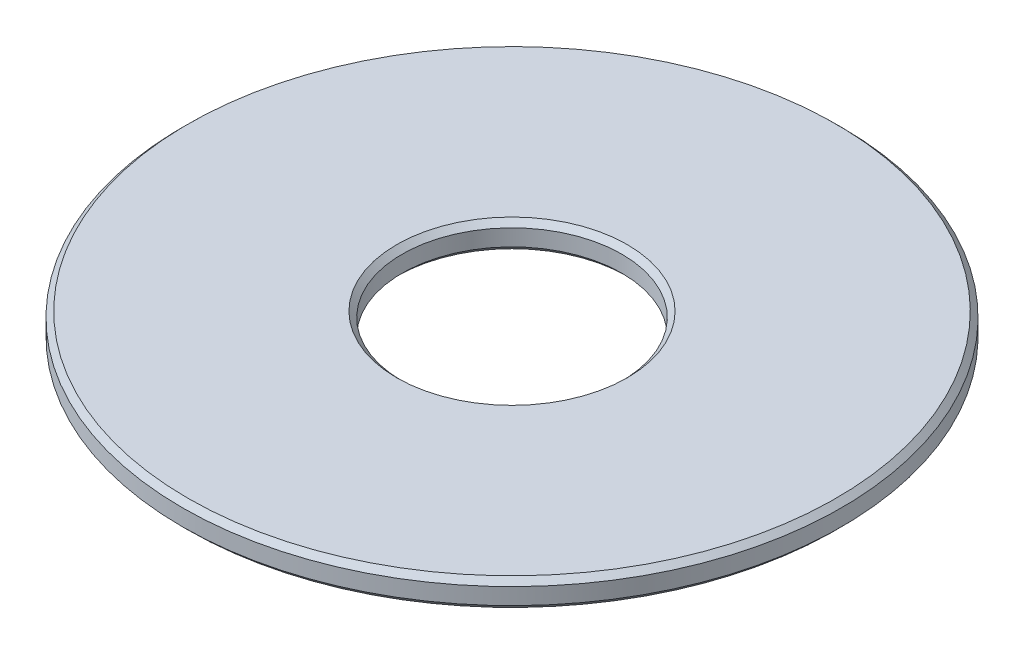
ISO-10303-21;
HEADER;
FILE_DESCRIPTION(('STEP AP214'),'2;1');
FILE_NAME('part.step','',(''),(''),'','','');
FILE_SCHEMA(('AUTOMOTIVE_DESIGN { 1 0 10303 214 1 1 1 1 }'));
ENDSEC;
DATA;
#1=APPLICATION_CONTEXT('core data for automotive mechanical design processes');
#2=APPLICATION_PROTOCOL_DEFINITION('international standard','automotive_design',2000,#1);
#3=PRODUCT_CONTEXT('',#1,'mechanical');
#4=PRODUCT('Part','Part','',(#3));
#5=PRODUCT_RELATED_PRODUCT_CATEGORY('part','',(#4));
#6=PRODUCT_DEFINITION_FORMATION('','',#4);
#7=PRODUCT_DEFINITION_CONTEXT('part definition',#1,'design');
#8=PRODUCT_DEFINITION('design','',#6,#7);
#9=PRODUCT_DEFINITION_SHAPE('','',#8);
#10=(LENGTH_UNIT() NAMED_UNIT(*) SI_UNIT(.MILLI.,.METRE.));
#11=(NAMED_UNIT(*) PLANE_ANGLE_UNIT() SI_UNIT($,.RADIAN.));
#12=(NAMED_UNIT(*) SI_UNIT($,.STERADIAN.) SOLID_ANGLE_UNIT());
#13=UNCERTAINTY_MEASURE_WITH_UNIT(LENGTH_MEASURE(1.E-05),#10,'distance_accuracy_value','');
#14=(GEOMETRIC_REPRESENTATION_CONTEXT(3) GLOBAL_UNCERTAINTY_ASSIGNED_CONTEXT((#13)) GLOBAL_UNIT_ASSIGNED_CONTEXT((#10,
#11,#12)) REPRESENTATION_CONTEXT('',''));
#15=CARTESIAN_POINT('',(0.,0.,0.));
#16=DIRECTION('',(0.,0.,1.));
#17=DIRECTION('',(1.,0.,0.));
#18=AXIS2_PLACEMENT_3D('',#15,#16,#17);
#19=CARTESIAN_POINT('',(0.,0.5,0.));
#20=DIRECTION('',(0.,1.,0.));
#21=DIRECTION('',(0.,0.,1.));
#22=AXIS2_PLACEMENT_3D('',#19,#20,#21);
#23=PLANE('',#22);
#24=CARTESIAN_POINT('',(0.,0.5,0.));
#25=DIRECTION('',(0.,1.,0.));
#26=DIRECTION('',(0.,0.,1.));
#27=AXIS2_PLACEMENT_3D('',#24,#25,#26);
#28=CIRCLE('',#27,2.1);
#29=CARTESIAN_POINT('',(0.,0.5,2.1));
#30=VERTEX_POINT('',#29);
#31=EDGE_CURVE('E10',#30,#30,#28,.F.);
#32=ORIENTED_EDGE('',*,*,#31,.T.);
#33=EDGE_LOOP('',(#32));
#34=FACE_BOUND('',#33,.T.);
#35=CARTESIAN_POINT('',(0.,0.5,0.));
#36=DIRECTION('',(0.,1.,0.));
#37=DIRECTION('',(0.,0.,1.));
#38=AXIS2_PLACEMENT_3D('',#35,#36,#37);
#39=CIRCLE('',#38,5.9);
#40=CARTESIAN_POINT('',(0.,0.5,5.9));
#41=VERTEX_POINT('',#40);
#42=EDGE_CURVE('E42',#41,#41,#39,.T.);
#43=ORIENTED_EDGE('',*,*,#42,.T.);
#44=EDGE_LOOP('',(#43));
#45=FACE_BOUND('',#44,.T.);
#46=ADVANCED_FACE('F34',(#34,#45),#23,.T.);
#47=CARTESIAN_POINT('',(0.,0.,0.));
#48=DIRECTION('',(0.,1.,0.));
#49=DIRECTION('',(0.,0.,1.));
#50=AXIS2_PLACEMENT_3D('',#47,#48,#49);
#51=PLANE('',#50);
#52=CARTESIAN_POINT('',(0.,0.,0.));
#53=DIRECTION('',(0.,1.,0.));
#54=DIRECTION('',(0.,0.,1.));
#55=AXIS2_PLACEMENT_3D('',#52,#53,#54);
#56=CIRCLE('',#55,2.1);
#57=CARTESIAN_POINT('',(0.,0.,2.1));
#58=VERTEX_POINT('',#57);
#59=EDGE_CURVE('E61',#58,#58,#56,.T.);
#60=ORIENTED_EDGE('',*,*,#59,.T.);
#61=EDGE_LOOP('',(#60));
#62=FACE_BOUND('',#61,.T.);
#63=CARTESIAN_POINT('',(0.,0.,0.));
#64=DIRECTION('',(0.,1.,0.));
#65=DIRECTION('',(0.,0.,1.));
#66=AXIS2_PLACEMENT_3D('',#63,#64,#65);
#67=CIRCLE('',#66,5.9);
#68=CARTESIAN_POINT('',(0.,0.,5.9));
#69=VERTEX_POINT('',#68);
#70=EDGE_CURVE('E64',#69,#69,#67,.F.);
#71=ORIENTED_EDGE('',*,*,#70,.T.);
#72=EDGE_LOOP('',(#71));
#73=FACE_BOUND('',#72,.T.);
#74=ADVANCED_FACE('F68',(#62,#73),#51,.F.);
#75=CARTESIAN_POINT('',(0.,0.5,0.));
#76=DIRECTION('',(0.,-1.,0.));
#77=DIRECTION('',(0.,0.,-1.));
#78=AXIS2_PLACEMENT_3D('',#75,#76,#77);
#79=CYLINDRICAL_SURFACE('',#78,6.);
#80=CARTESIAN_POINT('',(0.,0.1,0.));
#81=DIRECTION('',(0.,1.,0.));
#82=DIRECTION('',(0.,0.,1.));
#83=AXIS2_PLACEMENT_3D('',#80,#81,#82);
#84=CIRCLE('',#83,6.);
#85=CARTESIAN_POINT('',(0.,0.1,6.));
#86=VERTEX_POINT('',#85);
#87=EDGE_CURVE('E46',#86,#86,#84,.T.);
#88=ORIENTED_EDGE('',*,*,#87,.T.);
#89=EDGE_LOOP('',(#88));
#90=FACE_BOUND('',#89,.T.);
#91=CARTESIAN_POINT('',(0.,0.399999999999997,0.));
#92=DIRECTION('',(0.,1.,0.));
#93=DIRECTION('',(0.,0.,1.));
#94=AXIS2_PLACEMENT_3D('',#91,#92,#93);
#95=CIRCLE('',#94,6.);
#96=CARTESIAN_POINT('',(0.,0.399999999999997,6.));
#97=VERTEX_POINT('',#96);
#98=EDGE_CURVE('E50',#97,#97,#95,.F.);
#99=ORIENTED_EDGE('',*,*,#98,.T.);
#100=EDGE_LOOP('',(#99));
#101=FACE_BOUND('',#100,.T.);
#102=ADVANCED_FACE('F78',(#90,#101),#79,.T.);
#103=CARTESIAN_POINT('',(0.,0.5,0.));
#104=DIRECTION('',(0.,-1.,0.));
#105=DIRECTION('',(0.,0.,-1.));
#106=AXIS2_PLACEMENT_3D('',#103,#104,#105);
#107=CYLINDRICAL_SURFACE('',#106,2.);
#108=CARTESIAN_POINT('',(0.,0.0999999999999994,0.));
#109=DIRECTION('',(0.,1.,0.));
#110=DIRECTION('',(0.,0.,1.));
#111=AXIS2_PLACEMENT_3D('',#108,#109,#110);
#112=CIRCLE('',#111,2.);
#113=CARTESIAN_POINT('',(0.,0.0999999999999994,2.));
#114=VERTEX_POINT('',#113);
#115=EDGE_CURVE('E55',#114,#114,#112,.F.);
#116=ORIENTED_EDGE('',*,*,#115,.T.);
#117=EDGE_LOOP('',(#116));
#118=FACE_BOUND('',#117,.T.);
#119=CARTESIAN_POINT('',(0.,0.4,0.));
#120=DIRECTION('',(0.,1.,0.));
#121=DIRECTION('',(0.,0.,1.));
#122=AXIS2_PLACEMENT_3D('',#119,#120,#121);
#123=CIRCLE('',#122,2.);
#124=CARTESIAN_POINT('',(0.,0.4,2.));
#125=VERTEX_POINT('',#124);
#126=EDGE_CURVE('E58',#125,#125,#123,.T.);
#127=ORIENTED_EDGE('',*,*,#126,.T.);
#128=EDGE_LOOP('',(#127));
#129=FACE_BOUND('',#128,.T.);
#130=ADVANCED_FACE('F81',(#118,#129),#107,.F.);
#131=CARTESIAN_POINT('',(0.,0.,0.));
#132=DIRECTION('',(0.,-1.,0.));
#133=DIRECTION('',(0.,0.,-1.));
#134=AXIS2_PLACEMENT_3D('',#131,#132,#133);
#135=CONICAL_SURFACE('',#134,2.1,0.78539816339744);
#136=ORIENTED_EDGE('',*,*,#115,.F.);
#137=EDGE_LOOP('',(#136));
#138=FACE_BOUND('',#137,.T.);
#139=ORIENTED_EDGE('',*,*,#59,.F.);
#140=EDGE_LOOP('',(#139));
#141=FACE_BOUND('',#140,.T.);
#142=ADVANCED_FACE('F74',(#138,#141),#135,.F.);
#143=CARTESIAN_POINT('',(0.,0.1,0.));
#144=DIRECTION('',(0.,1.,0.));
#145=DIRECTION('',(0.,0.,1.));
#146=AXIS2_PLACEMENT_3D('',#143,#144,#145);
#147=CONICAL_SURFACE('',#146,6.,0.785398163397444);
#148=ORIENTED_EDGE('',*,*,#70,.F.);
#149=EDGE_LOOP('',(#148));
#150=FACE_BOUND('',#149,.T.);
#151=ORIENTED_EDGE('',*,*,#87,.F.);
#152=EDGE_LOOP('',(#151));
#153=FACE_BOUND('',#152,.T.);
#154=ADVANCED_FACE('F70',(#150,#153),#147,.T.);
#155=CARTESIAN_POINT('',(0.,0.4,0.));
#156=DIRECTION('',(0.,1.,0.));
#157=DIRECTION('',(0.,0.,1.));
#158=AXIS2_PLACEMENT_3D('',#155,#156,#157);
#159=CONICAL_SURFACE('',#158,2.,0.785398163397453);
#160=ORIENTED_EDGE('',*,*,#31,.F.);
#161=EDGE_LOOP('',(#160));
#162=FACE_BOUND('',#161,.T.);
#163=ORIENTED_EDGE('',*,*,#126,.F.);
#164=EDGE_LOOP('',(#163));
#165=FACE_BOUND('',#164,.T.);
#166=ADVANCED_FACE('F73',(#162,#165),#159,.F.);
#167=CARTESIAN_POINT('',(0.,0.5,0.));
#168=DIRECTION('',(0.,-1.,0.));
#169=DIRECTION('',(0.,0.,-1.));
#170=AXIS2_PLACEMENT_3D('',#167,#168,#169);
#171=CONICAL_SURFACE('',#170,5.9,0.785398163397453);
#172=ORIENTED_EDGE('',*,*,#98,.F.);
#173=EDGE_LOOP('',(#172));
#174=FACE_BOUND('',#173,.T.);
#175=ORIENTED_EDGE('',*,*,#42,.F.);
#176=EDGE_LOOP('',(#175));
#177=FACE_BOUND('',#176,.T.);
#178=ADVANCED_FACE('F37',(#174,#177),#171,.T.);
#179=CLOSED_SHELL('',(#46,#74,#102,#130,#142,#154,#166,#178));
#180=MANIFOLD_SOLID_BREP('B2',#179);
#181=ADVANCED_BREP_SHAPE_REPRESENTATION('',(#18,#180),#14);
#182=SHAPE_DEFINITION_REPRESENTATION(#9,#181);
ENDSEC;
END-ISO-10303-21;
